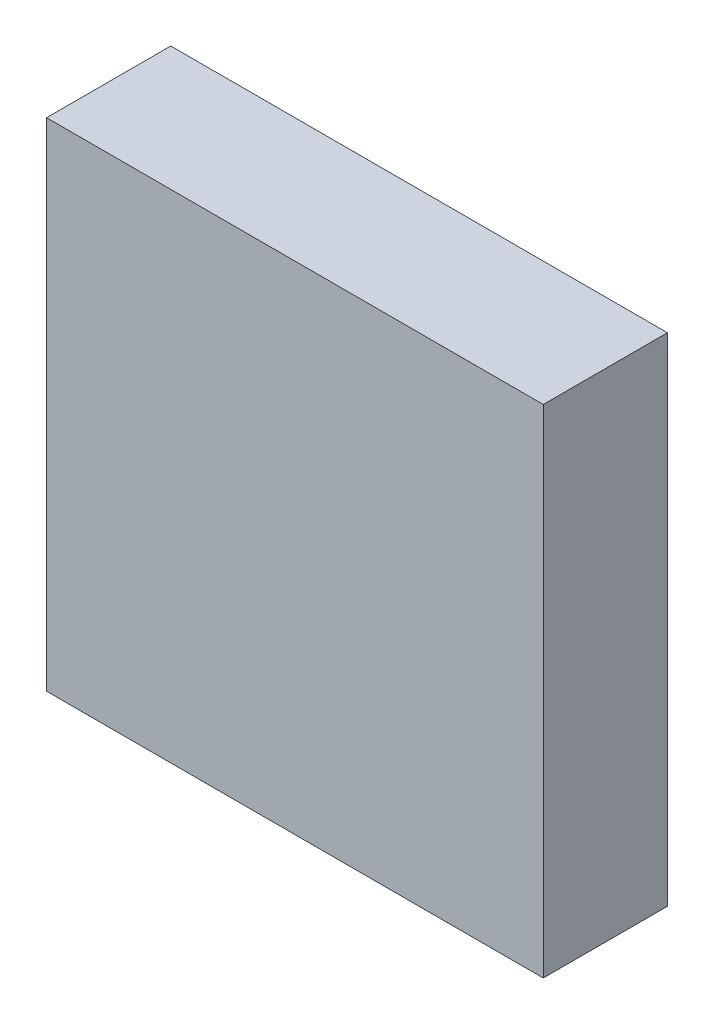
ISO-10303-21;
HEADER;
FILE_DESCRIPTION(('STEP AP214'),'2;1');
FILE_NAME('part.step','',(''),(''),'','','');
FILE_SCHEMA(('AUTOMOTIVE_DESIGN { 1 0 10303 214 1 1 1 1 }'));
ENDSEC;
DATA;
#1=APPLICATION_CONTEXT('core data for automotive mechanical design processes');
#2=APPLICATION_PROTOCOL_DEFINITION('international standard','automotive_design',2000,#1);
#3=PRODUCT_CONTEXT('',#1,'mechanical');
#4=PRODUCT('Part','Part','',(#3));
#5=PRODUCT_RELATED_PRODUCT_CATEGORY('part','',(#4));
#6=PRODUCT_DEFINITION_FORMATION('','',#4);
#7=PRODUCT_DEFINITION_CONTEXT('part definition',#1,'design');
#8=PRODUCT_DEFINITION('design','',#6,#7);
#9=PRODUCT_DEFINITION_SHAPE('','',#8);
#10=(LENGTH_UNIT() NAMED_UNIT(*) SI_UNIT(.MILLI.,.METRE.));
#11=(NAMED_UNIT(*) PLANE_ANGLE_UNIT() SI_UNIT($,.RADIAN.));
#12=(NAMED_UNIT(*) SI_UNIT($,.STERADIAN.) SOLID_ANGLE_UNIT());
#13=UNCERTAINTY_MEASURE_WITH_UNIT(LENGTH_MEASURE(1.E-05),#10,'distance_accuracy_value','');
#14=(GEOMETRIC_REPRESENTATION_CONTEXT(3) GLOBAL_UNCERTAINTY_ASSIGNED_CONTEXT((#13)) GLOBAL_UNIT_ASSIGNED_CONTEXT((#10,
#11,#12)) REPRESENTATION_CONTEXT('',''));
#15=CARTESIAN_POINT('',(0.,0.,0.));
#16=DIRECTION('',(0.,0.,1.));
#17=DIRECTION('',(1.,0.,0.));
#18=AXIS2_PLACEMENT_3D('',#15,#16,#17);
#19=CARTESIAN_POINT('',(0.,0.,50.));
#20=DIRECTION('',(1.,0.,0.));
#21=DIRECTION('',(0.,0.,-1.));
#22=AXIS2_PLACEMENT_3D('',#19,#20,#21);
#23=PLANE('',#22);
#24=DIRECTION('',(0.,-1.,0.));
#25=VECTOR('',#24,1.);
#26=CARTESIAN_POINT('',(0.,0.,0.));
#27=LINE('',#26,#25);
#28=CARTESIAN_POINT('',(0.,200.,0.));
#29=VERTEX_POINT('',#28);
#30=CARTESIAN_POINT('',(0.,0.,0.));
#31=VERTEX_POINT('',#30);
#32=EDGE_CURVE('E294',#29,#31,#27,.T.);
#33=ORIENTED_EDGE('',*,*,#32,.T.);
#34=DIRECTION('',(0.,0.,-1.));
#35=VECTOR('',#34,1.);
#36=CARTESIAN_POINT('',(0.,0.,50.));
#37=LINE('',#36,#35);
#38=CARTESIAN_POINT('',(0.,0.,50.));
#39=VERTEX_POINT('',#38);
#40=EDGE_CURVE('E11',#39,#31,#37,.T.);
#41=ORIENTED_EDGE('',*,*,#40,.F.);
#42=DIRECTION('',(0.,-1.,0.));
#43=VECTOR('',#42,1.);
#44=CARTESIAN_POINT('',(0.,0.,50.));
#45=LINE('',#44,#43);
#46=CARTESIAN_POINT('',(0.,200.,50.));
#47=VERTEX_POINT('',#46);
#48=EDGE_CURVE('E300',#47,#39,#45,.T.);
#49=ORIENTED_EDGE('',*,*,#48,.F.);
#50=DIRECTION('',(0.,0.,-1.));
#51=VECTOR('',#50,1.);
#52=CARTESIAN_POINT('',(0.,200.,50.));
#53=LINE('',#52,#51);
#54=EDGE_CURVE('E310',#47,#29,#53,.T.);
#55=ORIENTED_EDGE('',*,*,#54,.T.);
#56=EDGE_LOOP('',(#33,#41,#49,#55));
#57=FACE_BOUND('',#56,.T.);
#58=ADVANCED_FACE('F36',(#57),#23,.F.);
#59=CARTESIAN_POINT('',(0.,0.,50.));
#60=DIRECTION('',(0.,1.,0.));
#61=DIRECTION('',(0.,0.,1.));
#62=AXIS2_PLACEMENT_3D('',#59,#60,#61);
#63=PLANE('',#62);
#64=DIRECTION('',(1.,0.,0.));
#65=VECTOR('',#64,1.);
#66=CARTESIAN_POINT('',(0.,0.,0.));
#67=LINE('',#66,#65);
#68=CARTESIAN_POINT('',(200.,0.,0.));
#69=VERTEX_POINT('',#68);
#70=EDGE_CURVE('E313',#31,#69,#67,.T.);
#71=ORIENTED_EDGE('',*,*,#70,.T.);
#72=DIRECTION('',(0.,0.,-1.));
#73=VECTOR('',#72,1.);
#74=CARTESIAN_POINT('',(200.,0.,50.));
#75=LINE('',#74,#73);
#76=CARTESIAN_POINT('',(200.,0.,50.));
#77=VERTEX_POINT('',#76);
#78=EDGE_CURVE('E43',#77,#69,#75,.T.);
#79=ORIENTED_EDGE('',*,*,#78,.F.);
#80=DIRECTION('',(1.,0.,0.));
#81=VECTOR('',#80,1.);
#82=CARTESIAN_POINT('',(0.,0.,50.));
#83=LINE('',#82,#81);
#84=EDGE_CURVE('E303',#39,#77,#83,.T.);
#85=ORIENTED_EDGE('',*,*,#84,.F.);
#86=ORIENTED_EDGE('',*,*,#40,.T.);
#87=EDGE_LOOP('',(#71,#79,#85,#86));
#88=FACE_BOUND('',#87,.T.);
#89=ADVANCED_FACE('F343',(#88),#63,.F.);
#90=CARTESIAN_POINT('',(200.,0.,50.));
#91=DIRECTION('',(-1.,0.,0.));
#92=DIRECTION('',(0.,0.,1.));
#93=AXIS2_PLACEMENT_3D('',#90,#91,#92);
#94=PLANE('',#93);
#95=DIRECTION('',(0.,1.,0.));
#96=VECTOR('',#95,1.);
#97=CARTESIAN_POINT('',(200.,0.,0.));
#98=LINE('',#97,#96);
#99=CARTESIAN_POINT('',(200.,200.,0.));
#100=VERTEX_POINT('',#99);
#101=EDGE_CURVE('E315',#69,#100,#98,.T.);
#102=ORIENTED_EDGE('',*,*,#101,.T.);
#103=DIRECTION('',(0.,0.,-1.));
#104=VECTOR('',#103,1.);
#105=CARTESIAN_POINT('',(200.,200.,50.));
#106=LINE('',#105,#104);
#107=CARTESIAN_POINT('',(200.,200.,50.));
#108=VERTEX_POINT('',#107);
#109=EDGE_CURVE('E320',#108,#100,#106,.T.);
#110=ORIENTED_EDGE('',*,*,#109,.F.);
#111=DIRECTION('',(0.,1.,0.));
#112=VECTOR('',#111,1.);
#113=CARTESIAN_POINT('',(200.,0.,50.));
#114=LINE('',#113,#112);
#115=EDGE_CURVE('E306',#77,#108,#114,.T.);
#116=ORIENTED_EDGE('',*,*,#115,.F.);
#117=ORIENTED_EDGE('',*,*,#78,.T.);
#118=EDGE_LOOP('',(#102,#110,#116,#117));
#119=FACE_BOUND('',#118,.T.);
#120=ADVANCED_FACE('F327',(#119),#94,.F.);
#121=CARTESIAN_POINT('',(0.,200.,50.));
#122=DIRECTION('',(0.,-1.,0.));
#123=DIRECTION('',(0.,0.,-1.));
#124=AXIS2_PLACEMENT_3D('',#121,#122,#123);
#125=PLANE('',#124);
#126=DIRECTION('',(-1.,0.,0.));
#127=VECTOR('',#126,1.);
#128=CARTESIAN_POINT('',(0.,200.,0.));
#129=LINE('',#128,#127);
#130=EDGE_CURVE('E304',#100,#29,#129,.T.);
#131=ORIENTED_EDGE('',*,*,#130,.T.);
#132=ORIENTED_EDGE('',*,*,#54,.F.);
#133=DIRECTION('',(-1.,0.,0.));
#134=VECTOR('',#133,1.);
#135=CARTESIAN_POINT('',(0.,200.,50.));
#136=LINE('',#135,#134);
#137=EDGE_CURVE('E308',#108,#47,#136,.T.);
#138=ORIENTED_EDGE('',*,*,#137,.F.);
#139=ORIENTED_EDGE('',*,*,#109,.T.);
#140=EDGE_LOOP('',(#131,#132,#138,#139));
#141=FACE_BOUND('',#140,.T.);
#142=ADVANCED_FACE('F336',(#141),#125,.F.);
#143=CARTESIAN_POINT('',(0.,0.,50.));
#144=DIRECTION('',(0.,0.,-1.));
#145=DIRECTION('',(-1.,0.,0.));
#146=AXIS2_PLACEMENT_3D('',#143,#144,#145);
#147=PLANE('',#146);
#148=ORIENTED_EDGE('',*,*,#48,.T.);
#149=ORIENTED_EDGE('',*,*,#84,.T.);
#150=ORIENTED_EDGE('',*,*,#115,.T.);
#151=ORIENTED_EDGE('',*,*,#137,.T.);
#152=EDGE_LOOP('',(#148,#149,#150,#151));
#153=FACE_BOUND('',#152,.T.);
#154=ADVANCED_FACE('F342',(#153),#147,.F.);
#155=CARTESIAN_POINT('',(0.,0.,0.));
#156=DIRECTION('',(0.,0.,-1.));
#157=DIRECTION('',(-1.,0.,0.));
#158=AXIS2_PLACEMENT_3D('',#155,#156,#157);
#159=PLANE('',#158);
#160=DIRECTION('',(-1.,0.,0.));
#161=VECTOR('',#160,1.);
#162=CARTESIAN_POINT('',(179.5,174.65,0.));
#163=LINE('',#162,#161);
#164=CARTESIAN_POINT('',(179.5,174.65,0.));
#165=VERTEX_POINT('',#164);
#166=CARTESIAN_POINT('',(160.5,174.65,0.));
#167=VERTEX_POINT('',#166);
#168=EDGE_CURVE('E50',#165,#167,#163,.T.);
#169=ORIENTED_EDGE('',*,*,#168,.F.);
#170=DIRECTION('',(0.,-1.,0.));
#171=VECTOR('',#170,1.);
#172=CARTESIAN_POINT('',(179.5,176.55,0.));
#173=LINE('',#172,#171);
#174=CARTESIAN_POINT('',(179.5,178.95,0.));
#175=VERTEX_POINT('',#174);
#176=EDGE_CURVE('E232',#175,#165,#173,.T.);
#177=ORIENTED_EDGE('',*,*,#176,.F.);
#178=DIRECTION('',(1.,0.,0.));
#179=VECTOR('',#178,1.);
#180=CARTESIAN_POINT('',(179.5,178.95,0.));
#181=LINE('',#180,#179);
#182=CARTESIAN_POINT('',(160.5,178.95,0.));
#183=VERTEX_POINT('',#182);
#184=EDGE_CURVE('E228',#183,#175,#181,.T.);
#185=ORIENTED_EDGE('',*,*,#184,.F.);
#186=DIRECTION('',(0.,1.,0.));
#187=VECTOR('',#186,1.);
#188=CARTESIAN_POINT('',(160.5,177.05,0.));
#189=LINE('',#188,#187);
#190=EDGE_CURVE('E225',#167,#183,#189,.T.);
#191=ORIENTED_EDGE('',*,*,#190,.F.);
#192=EDGE_LOOP('',(#169,#177,#185,#191));
#193=FACE_BOUND('',#192,.T.);
#194=DIRECTION('',(1.,0.,0.));
#195=VECTOR('',#194,1.);
#196=CARTESIAN_POINT('',(20.5000000000001,25.35,0.));
#197=LINE('',#196,#195);
#198=CARTESIAN_POINT('',(20.5000000000001,25.35,0.));
#199=VERTEX_POINT('',#198);
#200=CARTESIAN_POINT('',(39.5000000000001,25.35,0.));
#201=VERTEX_POINT('',#200);
#202=EDGE_CURVE('E58',#199,#201,#197,.T.);
#203=ORIENTED_EDGE('',*,*,#202,.F.);
#204=DIRECTION('',(0.,1.,0.));
#205=VECTOR('',#204,1.);
#206=CARTESIAN_POINT('',(20.5000000000001,23.45,0.));
#207=LINE('',#206,#205);
#208=CARTESIAN_POINT('',(20.5000000000001,21.05,0.));
#209=VERTEX_POINT('',#208);
#210=EDGE_CURVE('E260',#209,#199,#207,.T.);
#211=ORIENTED_EDGE('',*,*,#210,.F.);
#212=DIRECTION('',(-1.,0.,0.));
#213=VECTOR('',#212,1.);
#214=CARTESIAN_POINT('',(20.5000000000001,21.05,0.));
#215=LINE('',#214,#213);
#216=CARTESIAN_POINT('',(39.5000000000001,21.05,0.));
#217=VERTEX_POINT('',#216);
#218=EDGE_CURVE('E257',#217,#209,#215,.T.);
#219=ORIENTED_EDGE('',*,*,#218,.F.);
#220=DIRECTION('',(0.,-1.,0.));
#221=VECTOR('',#220,1.);
#222=CARTESIAN_POINT('',(39.5000000000001,22.95,0.));
#223=LINE('',#222,#221);
#224=EDGE_CURVE('E210',#201,#217,#223,.T.);
#225=ORIENTED_EDGE('',*,*,#224,.F.);
#226=EDGE_LOOP('',(#203,#211,#219,#225));
#227=FACE_BOUND('',#226,.T.);
#228=DIRECTION('',(0.,1.,0.));
#229=VECTOR('',#228,1.);
#230=CARTESIAN_POINT('',(160.5,22.95,0.));
#231=LINE('',#230,#229);
#232=CARTESIAN_POINT('',(160.5,21.05,0.));
#233=VERTEX_POINT('',#232);
#234=CARTESIAN_POINT('',(160.5,25.35,0.));
#235=VERTEX_POINT('',#234);
#236=EDGE_CURVE('E181',#233,#235,#231,.T.);
#237=ORIENTED_EDGE('',*,*,#236,.F.);
#238=DIRECTION('',(-1.,0.,0.));
#239=VECTOR('',#238,1.);
#240=CARTESIAN_POINT('',(179.5,21.05,0.));
#241=LINE('',#240,#239);
#242=CARTESIAN_POINT('',(179.5,21.05,0.));
#243=VERTEX_POINT('',#242);
#244=EDGE_CURVE('E204',#243,#233,#241,.T.);
#245=ORIENTED_EDGE('',*,*,#244,.F.);
#246=DIRECTION('',(0.,-1.,0.));
#247=VECTOR('',#246,1.);
#248=CARTESIAN_POINT('',(179.5,22.95,0.));
#249=LINE('',#248,#247);
#250=CARTESIAN_POINT('',(179.5,25.35,0.));
#251=VERTEX_POINT('',#250);
#252=EDGE_CURVE('E201',#251,#243,#249,.T.);
#253=ORIENTED_EDGE('',*,*,#252,.F.);
#254=DIRECTION('',(1.,0.,0.));
#255=VECTOR('',#254,1.);
#256=CARTESIAN_POINT('',(179.5,25.35,0.));
#257=LINE('',#256,#255);
#258=EDGE_CURVE('E199',#235,#251,#257,.T.);
#259=ORIENTED_EDGE('',*,*,#258,.F.);
#260=EDGE_LOOP('',(#237,#245,#253,#259));
#261=FACE_BOUND('',#260,.T.);
#262=DIRECTION('',(0.,-1.,0.));
#263=VECTOR('',#262,1.);
#264=CARTESIAN_POINT('',(39.5000000000001,177.05,0.));
#265=LINE('',#264,#263);
#266=CARTESIAN_POINT('',(39.5000000000001,178.95,0.));
#267=VERTEX_POINT('',#266);
#268=CARTESIAN_POINT('',(39.5000000000001,174.65,0.));
#269=VERTEX_POINT('',#268);
#270=EDGE_CURVE('E273',#267,#269,#265,.T.);
#271=ORIENTED_EDGE('',*,*,#270,.F.);
#272=DIRECTION('',(1.,0.,0.));
#273=VECTOR('',#272,1.);
#274=CARTESIAN_POINT('',(20.5000000000001,178.95,0.));
#275=LINE('',#274,#273);
#276=CARTESIAN_POINT('',(20.5000000000001,178.95,0.));
#277=VERTEX_POINT('',#276);
#278=EDGE_CURVE('E287',#277,#267,#275,.T.);
#279=ORIENTED_EDGE('',*,*,#278,.F.);
#280=DIRECTION('',(0.,1.,0.));
#281=VECTOR('',#280,1.);
#282=CARTESIAN_POINT('',(20.5000000000001,177.05,0.));
#283=LINE('',#282,#281);
#284=CARTESIAN_POINT('',(20.5000000000001,174.65,0.));
#285=VERTEX_POINT('',#284);
#286=EDGE_CURVE('E284',#285,#277,#283,.T.);
#287=ORIENTED_EDGE('',*,*,#286,.F.);
#288=DIRECTION('',(-1.,0.,0.));
#289=VECTOR('',#288,1.);
#290=CARTESIAN_POINT('',(20.5000000000001,174.65,0.));
#291=LINE('',#290,#289);
#292=EDGE_CURVE('E238',#269,#285,#291,.T.);
#293=ORIENTED_EDGE('',*,*,#292,.F.);
#294=EDGE_LOOP('',(#271,#279,#287,#293));
#295=FACE_BOUND('',#294,.T.);
#296=ORIENTED_EDGE('',*,*,#32,.F.);
#297=ORIENTED_EDGE('',*,*,#130,.F.);
#298=ORIENTED_EDGE('',*,*,#101,.F.);
#299=ORIENTED_EDGE('',*,*,#70,.F.);
#300=EDGE_LOOP('',(#296,#297,#298,#299));
#301=FACE_BOUND('',#300,.T.);
#302=ADVANCED_FACE('F333',(#193,#227,#261,#295,#301),#159,.T.);
#303=CARTESIAN_POINT('',(39.5000000000001,177.05,7.));
#304=DIRECTION('',(1.,0.,0.));
#305=DIRECTION('',(0.,0.,-1.));
#306=AXIS2_PLACEMENT_3D('',#303,#304,#305);
#307=PLANE('',#306);
#308=ORIENTED_EDGE('',*,*,#270,.T.);
#309=DIRECTION('',(0.,0.,-1.));
#310=VECTOR('',#309,1.);
#311=CARTESIAN_POINT('',(39.5000000000001,174.65,7.));
#312=LINE('',#311,#310);
#313=CARTESIAN_POINT('',(39.5000000000001,174.65,7.));
#314=VERTEX_POINT('',#313);
#315=EDGE_CURVE('E281',#314,#269,#312,.T.);
#316=ORIENTED_EDGE('',*,*,#315,.F.);
#317=DIRECTION('',(0.,-1.,0.));
#318=VECTOR('',#317,1.);
#319=CARTESIAN_POINT('',(39.5000000000001,176.55,7.));
#320=LINE('',#319,#318);
#321=CARTESIAN_POINT('',(39.5000000000001,178.95,7.));
#322=VERTEX_POINT('',#321);
#323=EDGE_CURVE('E270',#322,#314,#320,.T.);
#324=ORIENTED_EDGE('',*,*,#323,.F.);
#325=DIRECTION('',(0.,0.,-1.));
#326=VECTOR('',#325,1.);
#327=CARTESIAN_POINT('',(39.5000000000001,178.95,7.));
#328=LINE('',#327,#326);
#329=EDGE_CURVE('E292',#322,#267,#328,.T.);
#330=ORIENTED_EDGE('',*,*,#329,.T.);
#331=EDGE_LOOP('',(#308,#316,#324,#330));
#332=FACE_BOUND('',#331,.T.);
#333=ADVANCED_FACE('F355',(#332),#307,.F.);
#334=CARTESIAN_POINT('',(20.5000000000001,178.95,7.));
#335=DIRECTION('',(0.,1.,0.));
#336=DIRECTION('',(0.,0.,1.));
#337=AXIS2_PLACEMENT_3D('',#334,#335,#336);
#338=PLANE('',#337);
#339=ORIENTED_EDGE('',*,*,#278,.T.);
#340=ORIENTED_EDGE('',*,*,#329,.F.);
#341=DIRECTION('',(1.,0.,0.));
#342=VECTOR('',#341,1.);
#343=CARTESIAN_POINT('',(20.5000000000001,178.95,7.));
#344=LINE('',#343,#342);
#345=CARTESIAN_POINT('',(20.5000000000001,178.95,7.));
#346=VERTEX_POINT('',#345);
#347=EDGE_CURVE('E278',#346,#322,#344,.T.);
#348=ORIENTED_EDGE('',*,*,#347,.F.);
#349=DIRECTION('',(0.,0.,-1.));
#350=VECTOR('',#349,1.);
#351=CARTESIAN_POINT('',(20.5000000000001,178.95,7.));
#352=LINE('',#351,#350);
#353=EDGE_CURVE('E295',#346,#277,#352,.T.);
#354=ORIENTED_EDGE('',*,*,#353,.T.);
#355=EDGE_LOOP('',(#339,#340,#348,#354));
#356=FACE_BOUND('',#355,.T.);
#357=ADVANCED_FACE('F367',(#356),#338,.F.);
#358=CARTESIAN_POINT('',(20.5000000000001,177.05,7.));
#359=DIRECTION('',(-1.,0.,0.));
#360=DIRECTION('',(0.,0.,1.));
#361=AXIS2_PLACEMENT_3D('',#358,#359,#360);
#362=PLANE('',#361);
#363=ORIENTED_EDGE('',*,*,#286,.T.);
#364=ORIENTED_EDGE('',*,*,#353,.F.);
#365=DIRECTION('',(0.,1.,0.));
#366=VECTOR('',#365,1.);
#367=CARTESIAN_POINT('',(20.5000000000001,176.55,7.));
#368=LINE('',#367,#366);
#369=CARTESIAN_POINT('',(20.5000000000001,174.65,7.));
#370=VERTEX_POINT('',#369);
#371=EDGE_CURVE('E276',#370,#346,#368,.T.);
#372=ORIENTED_EDGE('',*,*,#371,.F.);
#373=DIRECTION('',(0.,0.,-1.));
#374=VECTOR('',#373,1.);
#375=CARTESIAN_POINT('',(20.5000000000001,174.65,7.));
#376=LINE('',#375,#374);
#377=EDGE_CURVE('E297',#370,#285,#376,.T.);
#378=ORIENTED_EDGE('',*,*,#377,.T.);
#379=EDGE_LOOP('',(#363,#364,#372,#378));
#380=FACE_BOUND('',#379,.T.);
#381=ADVANCED_FACE('F363',(#380),#362,.F.);
#382=CARTESIAN_POINT('',(20.5000000000001,174.65,7.));
#383=DIRECTION('',(0.,-1.,0.));
#384=DIRECTION('',(0.,0.,-1.));
#385=AXIS2_PLACEMENT_3D('',#382,#383,#384);
#386=PLANE('',#385);
#387=ORIENTED_EDGE('',*,*,#292,.T.);
#388=ORIENTED_EDGE('',*,*,#377,.F.);
#389=DIRECTION('',(-1.,0.,0.));
#390=VECTOR('',#389,1.);
#391=CARTESIAN_POINT('',(20.5000000000001,174.65,7.));
#392=LINE('',#391,#390);
#393=EDGE_CURVE('E272',#314,#370,#392,.T.);
#394=ORIENTED_EDGE('',*,*,#393,.F.);
#395=ORIENTED_EDGE('',*,*,#315,.T.);
#396=EDGE_LOOP('',(#387,#388,#394,#395));
#397=FACE_BOUND('',#396,.T.);
#398=ADVANCED_FACE('F359',(#397),#386,.F.);
#399=CARTESIAN_POINT('',(0.,0.,7.));
#400=DIRECTION('',(0.,0.,-1.));
#401=DIRECTION('',(-1.,0.,0.));
#402=AXIS2_PLACEMENT_3D('',#399,#400,#401);
#403=PLANE('',#402);
#404=ORIENTED_EDGE('',*,*,#323,.T.);
#405=ORIENTED_EDGE('',*,*,#393,.T.);
#406=ORIENTED_EDGE('',*,*,#371,.T.);
#407=ORIENTED_EDGE('',*,*,#347,.T.);
#408=EDGE_LOOP('',(#404,#405,#406,#407));
#409=FACE_BOUND('',#408,.T.);
#410=ADVANCED_FACE('F362',(#409),#403,.T.);
#411=CARTESIAN_POINT('',(160.5,22.95,7.));
#412=DIRECTION('',(-1.,0.,0.));
#413=DIRECTION('',(0.,0.,1.));
#414=AXIS2_PLACEMENT_3D('',#411,#412,#413);
#415=PLANE('',#414);
#416=ORIENTED_EDGE('',*,*,#236,.T.);
#417=DIRECTION('',(0.,0.,-1.));
#418=VECTOR('',#417,1.);
#419=CARTESIAN_POINT('',(160.5,25.35,7.));
#420=LINE('',#419,#418);
#421=CARTESIAN_POINT('',(160.5,25.35,7.));
#422=VERTEX_POINT('',#421);
#423=EDGE_CURVE('E184',#422,#235,#420,.T.);
#424=ORIENTED_EDGE('',*,*,#423,.F.);
#425=DIRECTION('',(0.,1.,0.));
#426=VECTOR('',#425,1.);
#427=CARTESIAN_POINT('',(160.5,23.45,7.));
#428=LINE('',#427,#426);
#429=CARTESIAN_POINT('',(160.5,21.05,7.));
#430=VERTEX_POINT('',#429);
#431=EDGE_CURVE('E172',#430,#422,#428,.T.);
#432=ORIENTED_EDGE('',*,*,#431,.F.);
#433=DIRECTION('',(0.,0.,-1.));
#434=VECTOR('',#433,1.);
#435=CARTESIAN_POINT('',(160.5,21.05,7.));
#436=LINE('',#435,#434);
#437=EDGE_CURVE('E208',#430,#233,#436,.T.);
#438=ORIENTED_EDGE('',*,*,#437,.T.);
#439=EDGE_LOOP('',(#416,#424,#432,#438));
#440=FACE_BOUND('',#439,.T.);
#441=ADVANCED_FACE('F185',(#440),#415,.F.);
#442=CARTESIAN_POINT('',(179.5,21.05,7.));
#443=DIRECTION('',(0.,-1.,0.));
#444=DIRECTION('',(0.,0.,-1.));
#445=AXIS2_PLACEMENT_3D('',#442,#443,#444);
#446=PLANE('',#445);
#447=ORIENTED_EDGE('',*,*,#244,.T.);
#448=ORIENTED_EDGE('',*,*,#437,.F.);
#449=DIRECTION('',(-1.,0.,0.));
#450=VECTOR('',#449,1.);
#451=CARTESIAN_POINT('',(179.5,21.05,7.));
#452=LINE('',#451,#450);
#453=CARTESIAN_POINT('',(179.5,21.05,7.));
#454=VERTEX_POINT('',#453);
#455=EDGE_CURVE('E178',#454,#430,#452,.T.);
#456=ORIENTED_EDGE('',*,*,#455,.F.);
#457=DIRECTION('',(0.,0.,-1.));
#458=VECTOR('',#457,1.);
#459=CARTESIAN_POINT('',(179.5,21.05,7.));
#460=LINE('',#459,#458);
#461=EDGE_CURVE('E211',#454,#243,#460,.T.);
#462=ORIENTED_EDGE('',*,*,#461,.T.);
#463=EDGE_LOOP('',(#447,#448,#456,#462));
#464=FACE_BOUND('',#463,.T.);
#465=ADVANCED_FACE('F421',(#464),#446,.F.);
#466=CARTESIAN_POINT('',(179.5,22.95,7.));
#467=DIRECTION('',(1.,0.,0.));
#468=DIRECTION('',(0.,0.,-1.));
#469=AXIS2_PLACEMENT_3D('',#466,#467,#468);
#470=PLANE('',#469);
#471=ORIENTED_EDGE('',*,*,#252,.T.);
#472=ORIENTED_EDGE('',*,*,#461,.F.);
#473=DIRECTION('',(0.,-1.,0.));
#474=VECTOR('',#473,1.);
#475=CARTESIAN_POINT('',(179.5,23.45,7.));
#476=LINE('',#475,#474);
#477=CARTESIAN_POINT('',(179.5,25.35,7.));
#478=VERTEX_POINT('',#477);
#479=EDGE_CURVE('E194',#478,#454,#476,.T.);
#480=ORIENTED_EDGE('',*,*,#479,.F.);
#481=DIRECTION('',(0.,0.,-1.));
#482=VECTOR('',#481,1.);
#483=CARTESIAN_POINT('',(179.5,25.35,7.));
#484=LINE('',#483,#482);
#485=EDGE_CURVE('E190',#478,#251,#484,.T.);
#486=ORIENTED_EDGE('',*,*,#485,.T.);
#487=EDGE_LOOP('',(#471,#472,#480,#486));
#488=FACE_BOUND('',#487,.T.);
#489=ADVANCED_FACE('F418',(#488),#470,.F.);
#490=CARTESIAN_POINT('',(179.5,25.35,7.));
#491=DIRECTION('',(0.,1.,0.));
#492=DIRECTION('',(0.,0.,1.));
#493=AXIS2_PLACEMENT_3D('',#490,#491,#492);
#494=PLANE('',#493);
#495=ORIENTED_EDGE('',*,*,#258,.T.);
#496=ORIENTED_EDGE('',*,*,#485,.F.);
#497=DIRECTION('',(1.,0.,0.));
#498=VECTOR('',#497,1.);
#499=CARTESIAN_POINT('',(179.5,25.35,7.));
#500=LINE('',#499,#498);
#501=EDGE_CURVE('E176',#422,#478,#500,.T.);
#502=ORIENTED_EDGE('',*,*,#501,.F.);
#503=ORIENTED_EDGE('',*,*,#423,.T.);
#504=EDGE_LOOP('',(#495,#496,#502,#503));
#505=FACE_BOUND('',#504,.T.);
#506=ADVANCED_FACE('F192',(#505),#494,.F.);
#507=CARTESIAN_POINT('',(0.,0.,7.));
#508=DIRECTION('',(0.,0.,-1.));
#509=DIRECTION('',(-1.,0.,0.));
#510=AXIS2_PLACEMENT_3D('',#507,#508,#509);
#511=PLANE('',#510);
#512=ORIENTED_EDGE('',*,*,#431,.T.);
#513=ORIENTED_EDGE('',*,*,#501,.T.);
#514=ORIENTED_EDGE('',*,*,#479,.T.);
#515=ORIENTED_EDGE('',*,*,#455,.T.);
#516=EDGE_LOOP('',(#512,#513,#514,#515));
#517=FACE_BOUND('',#516,.T.);
#518=ADVANCED_FACE('F174',(#517),#511,.T.);
#519=CARTESIAN_POINT('',(20.5000000000001,25.35,7.));
#520=DIRECTION('',(0.,1.,0.));
#521=DIRECTION('',(0.,0.,1.));
#522=AXIS2_PLACEMENT_3D('',#519,#520,#521);
#523=PLANE('',#522);
#524=ORIENTED_EDGE('',*,*,#202,.T.);
#525=DIRECTION('',(0.,0.,-1.));
#526=VECTOR('',#525,1.);
#527=CARTESIAN_POINT('',(39.5000000000001,25.35,7.));
#528=LINE('',#527,#526);
#529=CARTESIAN_POINT('',(39.5000000000001,25.35,7.));
#530=VERTEX_POINT('',#529);
#531=EDGE_CURVE('E229',#530,#201,#528,.T.);
#532=ORIENTED_EDGE('',*,*,#531,.F.);
#533=DIRECTION('',(1.,0.,0.));
#534=VECTOR('',#533,1.);
#535=CARTESIAN_POINT('',(20.5000000000001,25.35,7.));
#536=LINE('',#535,#534);
#537=CARTESIAN_POINT('',(20.5000000000001,25.35,7.));
#538=VERTEX_POINT('',#537);
#539=EDGE_CURVE('E251',#538,#530,#536,.T.);
#540=ORIENTED_EDGE('',*,*,#539,.F.);
#541=DIRECTION('',(0.,0.,-1.));
#542=VECTOR('',#541,1.);
#543=CARTESIAN_POINT('',(20.5000000000001,25.35,7.));
#544=LINE('',#543,#542);
#545=EDGE_CURVE('E265',#538,#199,#544,.T.);
#546=ORIENTED_EDGE('',*,*,#545,.T.);
#547=EDGE_LOOP('',(#524,#532,#540,#546));
#548=FACE_BOUND('',#547,.T.);
#549=ADVANCED_FACE('F390',(#548),#523,.F.);
#550=CARTESIAN_POINT('',(20.5000000000001,23.45,7.));
#551=DIRECTION('',(-1.,0.,0.));
#552=DIRECTION('',(0.,0.,1.));
#553=AXIS2_PLACEMENT_3D('',#550,#551,#552);
#554=PLANE('',#553);
#555=ORIENTED_EDGE('',*,*,#210,.T.);
#556=ORIENTED_EDGE('',*,*,#545,.F.);
#557=DIRECTION('',(0.,1.,0.));
#558=VECTOR('',#557,1.);
#559=CARTESIAN_POINT('',(20.5000000000001,22.95,7.));
#560=LINE('',#559,#558);
#561=CARTESIAN_POINT('',(20.5000000000001,21.05,7.));
#562=VERTEX_POINT('',#561);
#563=EDGE_CURVE('E249',#562,#538,#560,.T.);
#564=ORIENTED_EDGE('',*,*,#563,.F.);
#565=DIRECTION('',(0.,0.,-1.));
#566=VECTOR('',#565,1.);
#567=CARTESIAN_POINT('',(20.5000000000001,21.05,7.));
#568=LINE('',#567,#566);
#569=EDGE_CURVE('E267',#562,#209,#568,.T.);
#570=ORIENTED_EDGE('',*,*,#569,.T.);
#571=EDGE_LOOP('',(#555,#556,#564,#570));
#572=FACE_BOUND('',#571,.T.);
#573=ADVANCED_FACE('F386',(#572),#554,.F.);
#574=CARTESIAN_POINT('',(20.5000000000001,21.05,7.));
#575=DIRECTION('',(0.,-1.,0.));
#576=DIRECTION('',(0.,0.,-1.));
#577=AXIS2_PLACEMENT_3D('',#574,#575,#576);
#578=PLANE('',#577);
#579=ORIENTED_EDGE('',*,*,#218,.T.);
#580=ORIENTED_EDGE('',*,*,#569,.F.);
#581=DIRECTION('',(-1.,0.,0.));
#582=VECTOR('',#581,1.);
#583=CARTESIAN_POINT('',(20.5000000000001,21.05,7.));
#584=LINE('',#583,#582);
#585=CARTESIAN_POINT('',(39.5000000000001,21.05,7.));
#586=VERTEX_POINT('',#585);
#587=EDGE_CURVE('E246',#586,#562,#584,.T.);
#588=ORIENTED_EDGE('',*,*,#587,.F.);
#589=DIRECTION('',(0.,0.,-1.));
#590=VECTOR('',#589,1.);
#591=CARTESIAN_POINT('',(39.5000000000001,21.05,7.));
#592=LINE('',#591,#590);
#593=EDGE_CURVE('E254',#586,#217,#592,.T.);
#594=ORIENTED_EDGE('',*,*,#593,.T.);
#595=EDGE_LOOP('',(#579,#580,#588,#594));
#596=FACE_BOUND('',#595,.T.);
#597=ADVANCED_FACE('F382',(#596),#578,.F.);
#598=CARTESIAN_POINT('',(39.5000000000001,22.95,7.));
#599=DIRECTION('',(1.,0.,0.));
#600=DIRECTION('',(0.,0.,-1.));
#601=AXIS2_PLACEMENT_3D('',#598,#599,#600);
#602=PLANE('',#601);
#603=ORIENTED_EDGE('',*,*,#224,.T.);
#604=ORIENTED_EDGE('',*,*,#593,.F.);
#605=DIRECTION('',(0.,-1.,0.));
#606=VECTOR('',#605,1.);
#607=CARTESIAN_POINT('',(39.5000000000001,23.45,7.));
#608=LINE('',#607,#606);
#609=EDGE_CURVE('E244',#530,#586,#608,.T.);
#610=ORIENTED_EDGE('',*,*,#609,.F.);
#611=ORIENTED_EDGE('',*,*,#531,.T.);
#612=EDGE_LOOP('',(#603,#604,#610,#611));
#613=FACE_BOUND('',#612,.T.);
#614=ADVANCED_FACE('F378',(#613),#602,.F.);
#615=CARTESIAN_POINT('',(0.,0.,7.));
#616=DIRECTION('',(0.,0.,-1.));
#617=DIRECTION('',(-1.,0.,0.));
#618=AXIS2_PLACEMENT_3D('',#615,#616,#617);
#619=PLANE('',#618);
#620=ORIENTED_EDGE('',*,*,#609,.T.);
#621=ORIENTED_EDGE('',*,*,#587,.T.);
#622=ORIENTED_EDGE('',*,*,#563,.T.);
#623=ORIENTED_EDGE('',*,*,#539,.T.);
#624=EDGE_LOOP('',(#620,#621,#622,#623));
#625=FACE_BOUND('',#624,.T.);
#626=ADVANCED_FACE('F381',(#625),#619,.T.);
#627=CARTESIAN_POINT('',(179.5,174.65,7.));
#628=DIRECTION('',(0.,-1.,0.));
#629=DIRECTION('',(0.,0.,-1.));
#630=AXIS2_PLACEMENT_3D('',#627,#628,#629);
#631=PLANE('',#630);
#632=ORIENTED_EDGE('',*,*,#168,.T.);
#633=DIRECTION('',(0.,0.,-1.));
#634=VECTOR('',#633,1.);
#635=CARTESIAN_POINT('',(160.5,174.65,7.));
#636=LINE('',#635,#634);
#637=CARTESIAN_POINT('',(160.5,174.65,7.));
#638=VERTEX_POINT('',#637);
#639=EDGE_CURVE('E236',#638,#167,#636,.T.);
#640=ORIENTED_EDGE('',*,*,#639,.F.);
#641=DIRECTION('',(-1.,0.,0.));
#642=VECTOR('',#641,1.);
#643=CARTESIAN_POINT('',(179.5,174.65,7.));
#644=LINE('',#643,#642);
#645=CARTESIAN_POINT('',(179.5,174.65,7.));
#646=VERTEX_POINT('',#645);
#647=EDGE_CURVE('E221',#646,#638,#644,.T.);
#648=ORIENTED_EDGE('',*,*,#647,.F.);
#649=DIRECTION('',(0.,0.,-1.));
#650=VECTOR('',#649,1.);
#651=CARTESIAN_POINT('',(179.5,174.65,7.));
#652=LINE('',#651,#650);
#653=EDGE_CURVE('E239',#646,#165,#652,.T.);
#654=ORIENTED_EDGE('',*,*,#653,.T.);
#655=EDGE_LOOP('',(#632,#640,#648,#654));
#656=FACE_BOUND('',#655,.T.);
#657=ADVANCED_FACE('F396',(#656),#631,.F.);
#658=CARTESIAN_POINT('',(179.5,176.55,7.));
#659=DIRECTION('',(1.,0.,0.));
#660=DIRECTION('',(0.,0.,-1.));
#661=AXIS2_PLACEMENT_3D('',#658,#659,#660);
#662=PLANE('',#661);
#663=ORIENTED_EDGE('',*,*,#176,.T.);
#664=ORIENTED_EDGE('',*,*,#653,.F.);
#665=DIRECTION('',(0.,-1.,0.));
#666=VECTOR('',#665,1.);
#667=CARTESIAN_POINT('',(179.5,177.05,7.));
#668=LINE('',#667,#666);
#669=CARTESIAN_POINT('',(179.5,178.95,7.));
#670=VERTEX_POINT('',#669);
#671=EDGE_CURVE('E219',#670,#646,#668,.T.);
#672=ORIENTED_EDGE('',*,*,#671,.F.);
#673=DIRECTION('',(0.,0.,-1.));
#674=VECTOR('',#673,1.);
#675=CARTESIAN_POINT('',(179.5,178.95,7.));
#676=LINE('',#675,#674);
#677=EDGE_CURVE('E241',#670,#175,#676,.T.);
#678=ORIENTED_EDGE('',*,*,#677,.T.);
#679=EDGE_LOOP('',(#663,#664,#672,#678));
#680=FACE_BOUND('',#679,.T.);
#681=ADVANCED_FACE('F406',(#680),#662,.F.);
#682=CARTESIAN_POINT('',(179.5,178.95,7.));
#683=DIRECTION('',(0.,1.,0.));
#684=DIRECTION('',(0.,0.,1.));
#685=AXIS2_PLACEMENT_3D('',#682,#683,#684);
#686=PLANE('',#685);
#687=ORIENTED_EDGE('',*,*,#184,.T.);
#688=ORIENTED_EDGE('',*,*,#677,.F.);
#689=DIRECTION('',(1.,0.,0.));
#690=VECTOR('',#689,1.);
#691=CARTESIAN_POINT('',(179.5,178.95,7.));
#692=LINE('',#691,#690);
#693=CARTESIAN_POINT('',(160.5,178.95,7.));
#694=VERTEX_POINT('',#693);
#695=EDGE_CURVE('E216',#694,#670,#692,.T.);
#696=ORIENTED_EDGE('',*,*,#695,.F.);
#697=DIRECTION('',(0.,0.,-1.));
#698=VECTOR('',#697,1.);
#699=CARTESIAN_POINT('',(160.5,178.95,7.));
#700=LINE('',#699,#698);
#701=EDGE_CURVE('E224',#694,#183,#700,.T.);
#702=ORIENTED_EDGE('',*,*,#701,.T.);
#703=EDGE_LOOP('',(#687,#688,#696,#702));
#704=FACE_BOUND('',#703,.T.);
#705=ADVANCED_FACE('F402',(#704),#686,.F.);
#706=CARTESIAN_POINT('',(160.5,177.05,7.));
#707=DIRECTION('',(-1.,0.,0.));
#708=DIRECTION('',(0.,0.,1.));
#709=AXIS2_PLACEMENT_3D('',#706,#707,#708);
#710=PLANE('',#709);
#711=ORIENTED_EDGE('',*,*,#190,.T.);
#712=ORIENTED_EDGE('',*,*,#701,.F.);
#713=DIRECTION('',(0.,1.,0.));
#714=VECTOR('',#713,1.);
#715=CARTESIAN_POINT('',(160.5,176.55,7.));
#716=LINE('',#715,#714);
#717=EDGE_CURVE('E214',#638,#694,#716,.T.);
#718=ORIENTED_EDGE('',*,*,#717,.F.);
#719=ORIENTED_EDGE('',*,*,#639,.T.);
#720=EDGE_LOOP('',(#711,#712,#718,#719));
#721=FACE_BOUND('',#720,.T.);
#722=ADVANCED_FACE('F398',(#721),#710,.F.);
#723=CARTESIAN_POINT('',(0.,0.,7.));
#724=DIRECTION('',(0.,0.,-1.));
#725=DIRECTION('',(-1.,0.,0.));
#726=AXIS2_PLACEMENT_3D('',#723,#724,#725);
#727=PLANE('',#726);
#728=ORIENTED_EDGE('',*,*,#717,.T.);
#729=ORIENTED_EDGE('',*,*,#695,.T.);
#730=ORIENTED_EDGE('',*,*,#671,.T.);
#731=ORIENTED_EDGE('',*,*,#647,.T.);
#732=EDGE_LOOP('',(#728,#729,#730,#731));
#733=FACE_BOUND('',#732,.T.);
#734=ADVANCED_FACE('F401',(#733),#727,.T.);
#735=CLOSED_SHELL('',(#58,#89,#120,#142,#154,#302,#333,#357,#381,#398,#410,#441,#465,#489,#506,
#518,#549,#573,#597,#614,#626,#657,#681,#705,#722,#734));
#736=MANIFOLD_SOLID_BREP('B2',#735);
#737=ADVANCED_BREP_SHAPE_REPRESENTATION('',(#18,#736),#14);
#738=SHAPE_DEFINITION_REPRESENTATION(#9,#737);
ENDSEC;
END-ISO-10303-21;
